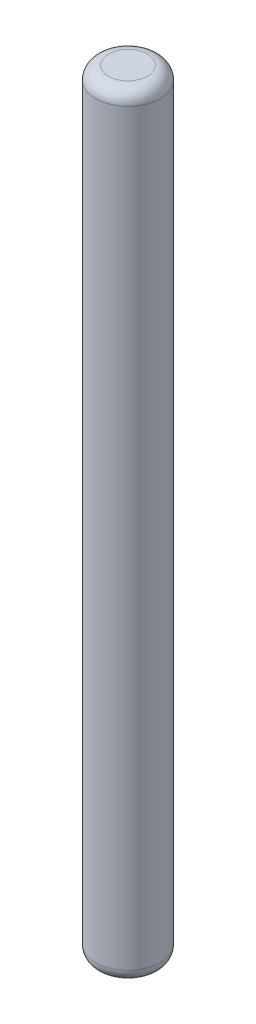
ISO-10303-21;
HEADER;
FILE_DESCRIPTION(('STEP AP214'),'2;1');
FILE_NAME('part.step','',(''),(''),'','','');
FILE_SCHEMA(('AUTOMOTIVE_DESIGN { 1 0 10303 214 1 1 1 1 }'));
ENDSEC;
DATA;
#1=APPLICATION_CONTEXT('core data for automotive mechanical design processes');
#2=APPLICATION_PROTOCOL_DEFINITION('international standard','automotive_design',2000,#1);
#3=PRODUCT_CONTEXT('',#1,'mechanical');
#4=PRODUCT('Part','Part','',(#3));
#5=PRODUCT_RELATED_PRODUCT_CATEGORY('part','',(#4));
#6=PRODUCT_DEFINITION_FORMATION('','',#4);
#7=PRODUCT_DEFINITION_CONTEXT('part definition',#1,'design');
#8=PRODUCT_DEFINITION('design','',#6,#7);
#9=PRODUCT_DEFINITION_SHAPE('','',#8);
#10=(LENGTH_UNIT() NAMED_UNIT(*) SI_UNIT(.MILLI.,.METRE.));
#11=(NAMED_UNIT(*) PLANE_ANGLE_UNIT() SI_UNIT($,.RADIAN.));
#12=(NAMED_UNIT(*) SI_UNIT($,.STERADIAN.) SOLID_ANGLE_UNIT());
#13=UNCERTAINTY_MEASURE_WITH_UNIT(LENGTH_MEASURE(1.E-05),#10,'distance_accuracy_value','');
#14=(GEOMETRIC_REPRESENTATION_CONTEXT(3) GLOBAL_UNCERTAINTY_ASSIGNED_CONTEXT((#13)) GLOBAL_UNIT_ASSIGNED_CONTEXT((#10,
#11,#12)) REPRESENTATION_CONTEXT('',''));
#15=CARTESIAN_POINT('',(0.,0.,0.));
#16=DIRECTION('',(0.,0.,1.));
#17=DIRECTION('',(1.,0.,0.));
#18=AXIS2_PLACEMENT_3D('',#15,#16,#17);
#19=CARTESIAN_POINT('',(0.,60.,0.));
#20=DIRECTION('',(0.,-1.,0.));
#21=DIRECTION('',(0.,0.,-1.));
#22=AXIS2_PLACEMENT_3D('',#19,#20,#21);
#23=CYLINDRICAL_SURFACE('',#22,2.5);
#24=CARTESIAN_POINT('',(0.,1.,0.));
#25=DIRECTION('',(0.,1.,0.));
#26=DIRECTION('',(0.,0.,1.));
#27=AXIS2_PLACEMENT_3D('',#24,#25,#26);
#28=CIRCLE('',#27,2.5);
#29=CARTESIAN_POINT('',(0.,1.,2.5));
#30=VERTEX_POINT('',#29);
#31=EDGE_CURVE('E56',#30,#30,#28,.T.);
#32=ORIENTED_EDGE('',*,*,#31,.T.);
#33=EDGE_LOOP('',(#32));
#34=FACE_BOUND('',#33,.T.);
#35=CARTESIAN_POINT('',(0.,59.,0.));
#36=DIRECTION('',(0.,1.,0.));
#37=DIRECTION('',(0.,0.,1.));
#38=AXIS2_PLACEMENT_3D('',#35,#36,#37);
#39=CIRCLE('',#38,2.5);
#40=CARTESIAN_POINT('',(0.,59.,2.5));
#41=VERTEX_POINT('',#40);
#42=EDGE_CURVE('E61',#41,#41,#39,.F.);
#43=ORIENTED_EDGE('',*,*,#42,.T.);
#44=EDGE_LOOP('',(#43));
#45=FACE_BOUND('',#44,.T.);
#46=ADVANCED_FACE('F43',(#34,#45),#23,.T.);
#47=CARTESIAN_POINT('',(0.,60.,0.));
#48=DIRECTION('',(0.,1.,0.));
#49=DIRECTION('',(0.,0.,1.));
#50=AXIS2_PLACEMENT_3D('',#47,#48,#49);
#51=PLANE('',#50);
#52=CARTESIAN_POINT('',(0.,60.,0.));
#53=DIRECTION('',(0.,1.,0.));
#54=DIRECTION('',(0.,0.,1.));
#55=AXIS2_PLACEMENT_3D('',#52,#53,#54);
#56=CIRCLE('',#55,1.5);
#57=CARTESIAN_POINT('',(0.,60.,1.5));
#58=VERTEX_POINT('',#57);
#59=EDGE_CURVE('E10',#58,#58,#56,.T.);
#60=ORIENTED_EDGE('',*,*,#59,.T.);
#61=EDGE_LOOP('',(#60));
#62=FACE_BOUND('',#61,.T.);
#63=ADVANCED_FACE('F78',(#62),#51,.T.);
#64=CARTESIAN_POINT('',(0.,0.,0.));
#65=DIRECTION('',(0.,1.,0.));
#66=DIRECTION('',(0.,0.,1.));
#67=AXIS2_PLACEMENT_3D('',#64,#65,#66);
#68=PLANE('',#67);
#69=CARTESIAN_POINT('',(0.,0.,0.));
#70=DIRECTION('',(0.,1.,0.));
#71=DIRECTION('',(0.,0.,1.));
#72=AXIS2_PLACEMENT_3D('',#69,#70,#71);
#73=CIRCLE('',#72,1.5);
#74=CARTESIAN_POINT('',(0.,0.,1.5));
#75=VERTEX_POINT('',#74);
#76=EDGE_CURVE('E51',#75,#75,#73,.F.);
#77=ORIENTED_EDGE('',*,*,#76,.T.);
#78=EDGE_LOOP('',(#77));
#79=FACE_BOUND('',#78,.T.);
#80=ADVANCED_FACE('F75',(#79),#68,.F.);
#81=CARTESIAN_POINT('',(0.,1.,0.));
#82=DIRECTION('',(0.,1.,0.));
#83=DIRECTION('',(0.,0.,1.));
#84=AXIS2_PLACEMENT_3D('',#81,#82,#83);
#85=TOROIDAL_SURFACE('',#84,1.5,1.);
#86=ORIENTED_EDGE('',*,*,#76,.F.);
#87=EDGE_LOOP('',(#86));
#88=FACE_BOUND('',#87,.T.);
#89=ORIENTED_EDGE('',*,*,#31,.F.);
#90=EDGE_LOOP('',(#89));
#91=FACE_BOUND('',#90,.T.);
#92=ADVANCED_FACE('F71',(#88,#91),#85,.T.);
#93=CARTESIAN_POINT('',(0.,59.,0.));
#94=DIRECTION('',(0.,1.,0.));
#95=DIRECTION('',(0.,0.,1.));
#96=AXIS2_PLACEMENT_3D('',#93,#94,#95);
#97=TOROIDAL_SURFACE('',#96,1.5,1.);
#98=ORIENTED_EDGE('',*,*,#42,.F.);
#99=EDGE_LOOP('',(#98));
#100=FACE_BOUND('',#99,.T.);
#101=ORIENTED_EDGE('',*,*,#59,.F.);
#102=EDGE_LOOP('',(#101));
#103=FACE_BOUND('',#102,.T.);
#104=ADVANCED_FACE('F45',(#100,#103),#97,.T.);
#105=CLOSED_SHELL('',(#46,#63,#80,#92,#104));
#106=MANIFOLD_SOLID_BREP('B2',#105);
#107=ADVANCED_BREP_SHAPE_REPRESENTATION('',(#18,#106),#14);
#108=SHAPE_DEFINITION_REPRESENTATION(#9,#107);
ENDSEC;
END-ISO-10303-21;
